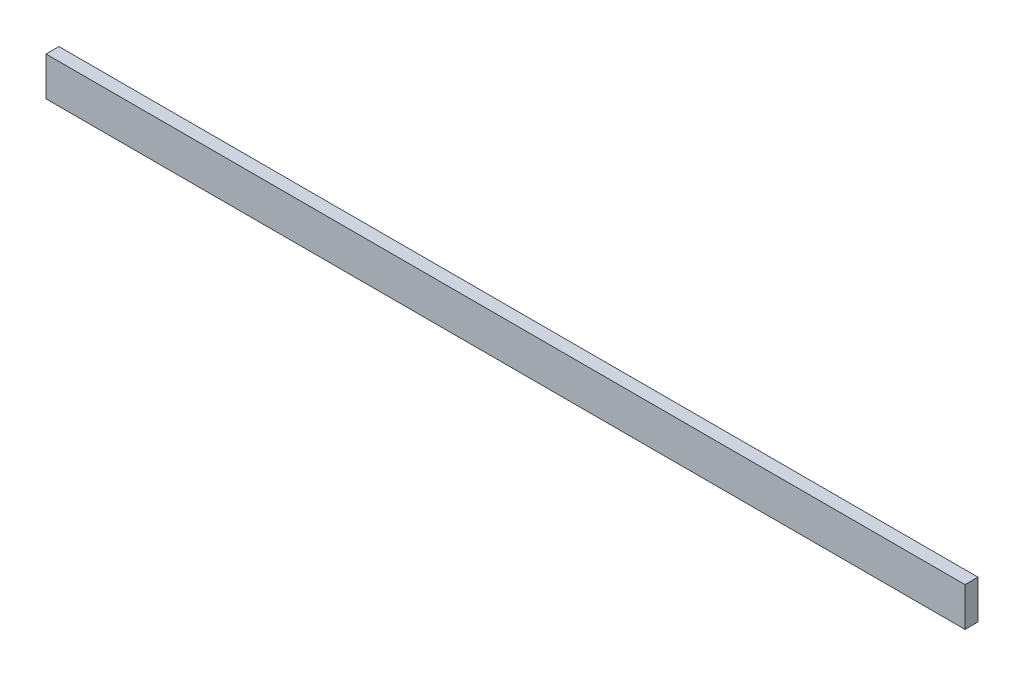
ISO-10303-21;
HEADER;
FILE_DESCRIPTION(('STEP AP214'),'2;1');
FILE_NAME('part.step','',(''),(''),'','','');
FILE_SCHEMA(('AUTOMOTIVE_DESIGN { 1 0 10303 214 1 1 1 1 }'));
ENDSEC;
DATA;
#1=APPLICATION_CONTEXT('core data for automotive mechanical design processes');
#2=APPLICATION_PROTOCOL_DEFINITION('international standard','automotive_design',2000,#1);
#3=PRODUCT_CONTEXT('',#1,'mechanical');
#4=PRODUCT('Part','Part','',(#3));
#5=PRODUCT_RELATED_PRODUCT_CATEGORY('part','',(#4));
#6=PRODUCT_DEFINITION_FORMATION('','',#4);
#7=PRODUCT_DEFINITION_CONTEXT('part definition',#1,'design');
#8=PRODUCT_DEFINITION('design','',#6,#7);
#9=PRODUCT_DEFINITION_SHAPE('','',#8);
#10=(LENGTH_UNIT() NAMED_UNIT(*) SI_UNIT(.MILLI.,.METRE.));
#11=(NAMED_UNIT(*) PLANE_ANGLE_UNIT() SI_UNIT($,.RADIAN.));
#12=(NAMED_UNIT(*) SI_UNIT($,.STERADIAN.) SOLID_ANGLE_UNIT());
#13=UNCERTAINTY_MEASURE_WITH_UNIT(LENGTH_MEASURE(1.E-05),#10,'distance_accuracy_value','');
#14=(GEOMETRIC_REPRESENTATION_CONTEXT(3) GLOBAL_UNCERTAINTY_ASSIGNED_CONTEXT((#13)) GLOBAL_UNIT_ASSIGNED_CONTEXT((#10,
#11,#12)) REPRESENTATION_CONTEXT('',''));
#15=CARTESIAN_POINT('',(0.,0.,0.));
#16=DIRECTION('',(0.,0.,1.));
#17=DIRECTION('',(1.,0.,0.));
#18=AXIS2_PLACEMENT_3D('',#15,#16,#17);
#19=CARTESIAN_POINT('',(0.,0.,12.7));
#20=DIRECTION('',(1.,0.,0.));
#21=DIRECTION('',(0.,0.,-1.));
#22=AXIS2_PLACEMENT_3D('',#19,#20,#21);
#23=PLANE('',#22);
#24=DIRECTION('',(0.,-1.,0.));
#25=VECTOR('',#24,1.);
#26=CARTESIAN_POINT('',(0.,0.,0.));
#27=LINE('',#26,#25);
#28=CARTESIAN_POINT('',(0.,38.1,0.));
#29=VERTEX_POINT('',#28);
#30=CARTESIAN_POINT('',(0.,0.,0.));
#31=VERTEX_POINT('',#30);
#32=EDGE_CURVE('E97',#29,#31,#27,.T.);
#33=ORIENTED_EDGE('',*,*,#32,.T.);
#34=DIRECTION('',(0.,0.,-1.));
#35=VECTOR('',#34,1.);
#36=CARTESIAN_POINT('',(0.,0.,12.7));
#37=LINE('',#36,#35);
#38=CARTESIAN_POINT('',(0.,0.,12.7));
#39=VERTEX_POINT('',#38);
#40=EDGE_CURVE('E11',#39,#31,#37,.T.);
#41=ORIENTED_EDGE('',*,*,#40,.F.);
#42=DIRECTION('',(0.,-1.,0.));
#43=VECTOR('',#42,1.);
#44=CARTESIAN_POINT('',(0.,0.,12.7));
#45=LINE('',#44,#43);
#46=CARTESIAN_POINT('',(0.,38.1,12.7));
#47=VERTEX_POINT('',#46);
#48=EDGE_CURVE('E85',#47,#39,#45,.T.);
#49=ORIENTED_EDGE('',*,*,#48,.F.);
#50=DIRECTION('',(0.,0.,-1.));
#51=VECTOR('',#50,1.);
#52=CARTESIAN_POINT('',(0.,38.1,12.7));
#53=LINE('',#52,#51);
#54=EDGE_CURVE('E93',#47,#29,#53,.T.);
#55=ORIENTED_EDGE('',*,*,#54,.T.);
#56=EDGE_LOOP('',(#33,#41,#49,#55));
#57=FACE_BOUND('',#56,.T.);
#58=ADVANCED_FACE('F34',(#57),#23,.F.);
#59=CARTESIAN_POINT('',(0.,0.,12.7));
#60=DIRECTION('',(0.,1.,0.));
#61=DIRECTION('',(0.,0.,1.));
#62=AXIS2_PLACEMENT_3D('',#59,#60,#61);
#63=PLANE('',#62);
#64=DIRECTION('',(1.,0.,0.));
#65=VECTOR('',#64,1.);
#66=CARTESIAN_POINT('',(0.,0.,0.));
#67=LINE('',#66,#65);
#68=CARTESIAN_POINT('',(901.7,0.,0.));
#69=VERTEX_POINT('',#68);
#70=EDGE_CURVE('E89',#31,#69,#67,.T.);
#71=ORIENTED_EDGE('',*,*,#70,.T.);
#72=DIRECTION('',(0.,0.,-1.));
#73=VECTOR('',#72,1.);
#74=CARTESIAN_POINT('',(901.7,0.,12.7));
#75=LINE('',#74,#73);
#76=CARTESIAN_POINT('',(901.7,0.,12.7));
#77=VERTEX_POINT('',#76);
#78=EDGE_CURVE('E42',#77,#69,#75,.T.);
#79=ORIENTED_EDGE('',*,*,#78,.F.);
#80=DIRECTION('',(1.,0.,0.));
#81=VECTOR('',#80,1.);
#82=CARTESIAN_POINT('',(0.,0.,12.7));
#83=LINE('',#82,#81);
#84=EDGE_CURVE('E80',#39,#77,#83,.T.);
#85=ORIENTED_EDGE('',*,*,#84,.F.);
#86=ORIENTED_EDGE('',*,*,#40,.T.);
#87=EDGE_LOOP('',(#71,#79,#85,#86));
#88=FACE_BOUND('',#87,.T.);
#89=ADVANCED_FACE('F88',(#88),#63,.F.);
#90=CARTESIAN_POINT('',(901.7,0.,12.7));
#91=DIRECTION('',(-1.,0.,0.));
#92=DIRECTION('',(0.,0.,1.));
#93=AXIS2_PLACEMENT_3D('',#90,#91,#92);
#94=PLANE('',#93);
#95=DIRECTION('',(0.,1.,0.));
#96=VECTOR('',#95,1.);
#97=CARTESIAN_POINT('',(901.7,0.,0.));
#98=LINE('',#97,#96);
#99=CARTESIAN_POINT('',(901.7,38.1,0.));
#100=VERTEX_POINT('',#99);
#101=EDGE_CURVE('E67',#69,#100,#98,.T.);
#102=ORIENTED_EDGE('',*,*,#101,.T.);
#103=DIRECTION('',(0.,0.,-1.));
#104=VECTOR('',#103,1.);
#105=CARTESIAN_POINT('',(901.7,38.1,12.7));
#106=LINE('',#105,#104);
#107=CARTESIAN_POINT('',(901.7,38.1,12.7));
#108=VERTEX_POINT('',#107);
#109=EDGE_CURVE('E90',#108,#100,#106,.T.);
#110=ORIENTED_EDGE('',*,*,#109,.F.);
#111=DIRECTION('',(0.,1.,0.));
#112=VECTOR('',#111,1.);
#113=CARTESIAN_POINT('',(901.7,0.,12.7));
#114=LINE('',#113,#112);
#115=EDGE_CURVE('E83',#77,#108,#114,.T.);
#116=ORIENTED_EDGE('',*,*,#115,.F.);
#117=ORIENTED_EDGE('',*,*,#78,.T.);
#118=EDGE_LOOP('',(#102,#110,#116,#117));
#119=FACE_BOUND('',#118,.T.);
#120=ADVANCED_FACE('F91',(#119),#94,.F.);
#121=CARTESIAN_POINT('',(0.,38.1,12.7));
#122=DIRECTION('',(0.,-1.,0.));
#123=DIRECTION('',(0.,0.,-1.));
#124=AXIS2_PLACEMENT_3D('',#121,#122,#123);
#125=PLANE('',#124);
#126=DIRECTION('',(-1.,0.,0.));
#127=VECTOR('',#126,1.);
#128=CARTESIAN_POINT('',(0.,38.1,0.));
#129=LINE('',#128,#127);
#130=EDGE_CURVE('E73',#100,#29,#129,.T.);
#131=ORIENTED_EDGE('',*,*,#130,.T.);
#132=ORIENTED_EDGE('',*,*,#54,.F.);
#133=DIRECTION('',(-1.,0.,0.));
#134=VECTOR('',#133,1.);
#135=CARTESIAN_POINT('',(0.,38.1,12.7));
#136=LINE('',#135,#134);
#137=EDGE_CURVE('E50',#108,#47,#136,.T.);
#138=ORIENTED_EDGE('',*,*,#137,.F.);
#139=ORIENTED_EDGE('',*,*,#109,.T.);
#140=EDGE_LOOP('',(#131,#132,#138,#139));
#141=FACE_BOUND('',#140,.T.);
#142=ADVANCED_FACE('F104',(#141),#125,.F.);
#143=CARTESIAN_POINT('',(0.,0.,12.7));
#144=DIRECTION('',(0.,0.,-1.));
#145=DIRECTION('',(-1.,0.,0.));
#146=AXIS2_PLACEMENT_3D('',#143,#144,#145);
#147=PLANE('',#146);
#148=ORIENTED_EDGE('',*,*,#48,.T.);
#149=ORIENTED_EDGE('',*,*,#84,.T.);
#150=ORIENTED_EDGE('',*,*,#115,.T.);
#151=ORIENTED_EDGE('',*,*,#137,.T.);
#152=EDGE_LOOP('',(#148,#149,#150,#151));
#153=FACE_BOUND('',#152,.T.);
#154=ADVANCED_FACE('F81',(#153),#147,.F.);
#155=CARTESIAN_POINT('',(0.,0.,0.));
#156=DIRECTION('',(0.,0.,-1.));
#157=DIRECTION('',(-1.,0.,0.));
#158=AXIS2_PLACEMENT_3D('',#155,#156,#157);
#159=PLANE('',#158);
#160=ORIENTED_EDGE('',*,*,#32,.F.);
#161=ORIENTED_EDGE('',*,*,#130,.F.);
#162=ORIENTED_EDGE('',*,*,#101,.F.);
#163=ORIENTED_EDGE('',*,*,#70,.F.);
#164=EDGE_LOOP('',(#160,#161,#162,#163));
#165=FACE_BOUND('',#164,.T.);
#166=ADVANCED_FACE('F107',(#165),#159,.T.);
#167=CLOSED_SHELL('',(#58,#89,#120,#142,#154,#166));
#168=MANIFOLD_SOLID_BREP('B2',#167);
#169=ADVANCED_BREP_SHAPE_REPRESENTATION('',(#18,#168),#14);
#170=SHAPE_DEFINITION_REPRESENTATION(#9,#169);
ENDSEC;
END-ISO-10303-21;
